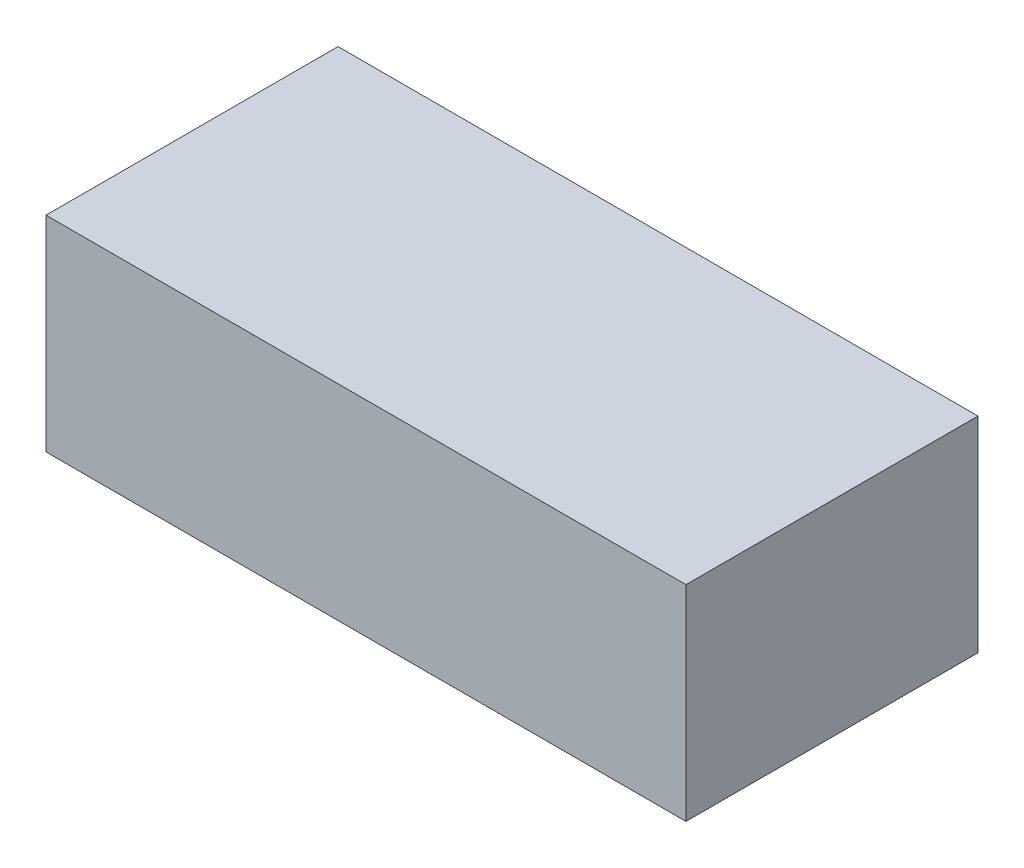
ISO-10303-21;
HEADER;
FILE_DESCRIPTION(('STEP AP214'),'2;1');
FILE_NAME('part.step','',(''),(''),'','','');
FILE_SCHEMA(('AUTOMOTIVE_DESIGN { 1 0 10303 214 1 1 1 1 }'));
ENDSEC;
DATA;
#1=APPLICATION_CONTEXT('core data for automotive mechanical design processes');
#2=APPLICATION_PROTOCOL_DEFINITION('international standard','automotive_design',2000,#1);
#3=PRODUCT_CONTEXT('',#1,'mechanical');
#4=PRODUCT('Part','Part','',(#3));
#5=PRODUCT_RELATED_PRODUCT_CATEGORY('part','',(#4));
#6=PRODUCT_DEFINITION_FORMATION('','',#4);
#7=PRODUCT_DEFINITION_CONTEXT('part definition',#1,'design');
#8=PRODUCT_DEFINITION('design','',#6,#7);
#9=PRODUCT_DEFINITION_SHAPE('','',#8);
#10=(LENGTH_UNIT() NAMED_UNIT(*) SI_UNIT(.MILLI.,.METRE.));
#11=(NAMED_UNIT(*) PLANE_ANGLE_UNIT() SI_UNIT($,.RADIAN.));
#12=(NAMED_UNIT(*) SI_UNIT($,.STERADIAN.) SOLID_ANGLE_UNIT());
#13=UNCERTAINTY_MEASURE_WITH_UNIT(LENGTH_MEASURE(1.E-05),#10,'distance_accuracy_value','');
#14=(GEOMETRIC_REPRESENTATION_CONTEXT(3) GLOBAL_UNCERTAINTY_ASSIGNED_CONTEXT((#13)) GLOBAL_UNIT_ASSIGNED_CONTEXT((#10,
#11,#12)) REPRESENTATION_CONTEXT('',''));
#15=CARTESIAN_POINT('',(0.,0.,0.));
#16=DIRECTION('',(0.,0.,1.));
#17=DIRECTION('',(1.,0.,0.));
#18=AXIS2_PLACEMENT_3D('',#15,#16,#17);
#19=CARTESIAN_POINT('',(51.5,16.5,23.5));
#20=DIRECTION('',(-1.,0.,0.));
#21=DIRECTION('',(0.,0.,1.));
#22=AXIS2_PLACEMENT_3D('',#19,#20,#21);
#23=PLANE('',#22);
#24=DIRECTION('',(0.,1.,0.));
#25=VECTOR('',#24,1.);
#26=CARTESIAN_POINT('',(51.5,16.5,-23.5));
#27=LINE('',#26,#25);
#28=CARTESIAN_POINT('',(51.5,-16.5,-23.5));
#29=VERTEX_POINT('',#28);
#30=CARTESIAN_POINT('',(51.5,16.5,-23.5));
#31=VERTEX_POINT('',#30);
#32=EDGE_CURVE('E102',#29,#31,#27,.T.);
#33=ORIENTED_EDGE('',*,*,#32,.T.);
#34=DIRECTION('',(0.,0.,-1.));
#35=VECTOR('',#34,1.);
#36=CARTESIAN_POINT('',(51.5,16.5,23.5));
#37=LINE('',#36,#35);
#38=CARTESIAN_POINT('',(51.5,16.5,23.5));
#39=VERTEX_POINT('',#38);
#40=EDGE_CURVE('E11',#39,#31,#37,.T.);
#41=ORIENTED_EDGE('',*,*,#40,.F.);
#42=DIRECTION('',(0.,1.,0.));
#43=VECTOR('',#42,1.);
#44=CARTESIAN_POINT('',(51.5,16.5,23.5));
#45=LINE('',#44,#43);
#46=CARTESIAN_POINT('',(51.5,-16.5,23.5));
#47=VERTEX_POINT('',#46);
#48=EDGE_CURVE('E95',#47,#39,#45,.T.);
#49=ORIENTED_EDGE('',*,*,#48,.F.);
#50=DIRECTION('',(0.,0.,-1.));
#51=VECTOR('',#50,1.);
#52=CARTESIAN_POINT('',(51.5,-16.5,23.5));
#53=LINE('',#52,#51);
#54=EDGE_CURVE('E99',#47,#29,#53,.T.);
#55=ORIENTED_EDGE('',*,*,#54,.T.);
#56=EDGE_LOOP('',(#33,#41,#49,#55));
#57=FACE_BOUND('',#56,.T.);
#58=ADVANCED_FACE('F41',(#57),#23,.F.);
#59=CARTESIAN_POINT('',(-51.5,16.5,23.5));
#60=DIRECTION('',(0.,-1.,0.));
#61=DIRECTION('',(0.,0.,-1.));
#62=AXIS2_PLACEMENT_3D('',#59,#60,#61);
#63=PLANE('',#62);
#64=DIRECTION('',(-1.,0.,0.));
#65=VECTOR('',#64,1.);
#66=CARTESIAN_POINT('',(-51.5,16.5,-23.5));
#67=LINE('',#66,#65);
#68=CARTESIAN_POINT('',(-51.5,16.5,-23.5));
#69=VERTEX_POINT('',#68);
#70=EDGE_CURVE('E96',#31,#69,#67,.T.);
#71=ORIENTED_EDGE('',*,*,#70,.T.);
#72=DIRECTION('',(0.,0.,-1.));
#73=VECTOR('',#72,1.);
#74=CARTESIAN_POINT('',(-51.5,16.5,23.5));
#75=LINE('',#74,#73);
#76=CARTESIAN_POINT('',(-51.5,16.5,23.5));
#77=VERTEX_POINT('',#76);
#78=EDGE_CURVE('E47',#77,#69,#75,.T.);
#79=ORIENTED_EDGE('',*,*,#78,.F.);
#80=DIRECTION('',(-1.,0.,0.));
#81=VECTOR('',#80,1.);
#82=CARTESIAN_POINT('',(-51.5,16.5,23.5));
#83=LINE('',#82,#81);
#84=EDGE_CURVE('E87',#39,#77,#83,.T.);
#85=ORIENTED_EDGE('',*,*,#84,.F.);
#86=ORIENTED_EDGE('',*,*,#40,.T.);
#87=EDGE_LOOP('',(#71,#79,#85,#86));
#88=FACE_BOUND('',#87,.T.);
#89=ADVANCED_FACE('F92',(#88),#63,.F.);
#90=CARTESIAN_POINT('',(-51.5,16.5,23.5));
#91=DIRECTION('',(1.,0.,0.));
#92=DIRECTION('',(0.,0.,-1.));
#93=AXIS2_PLACEMENT_3D('',#90,#91,#92);
#94=PLANE('',#93);
#95=DIRECTION('',(0.,-1.,0.));
#96=VECTOR('',#95,1.);
#97=CARTESIAN_POINT('',(-51.5,16.5,-23.5));
#98=LINE('',#97,#96);
#99=CARTESIAN_POINT('',(-51.5,-16.5,-23.5));
#100=VERTEX_POINT('',#99);
#101=EDGE_CURVE('E74',#69,#100,#98,.T.);
#102=ORIENTED_EDGE('',*,*,#101,.T.);
#103=DIRECTION('',(0.,0.,-1.));
#104=VECTOR('',#103,1.);
#105=CARTESIAN_POINT('',(-51.5,-16.5,23.5));
#106=LINE('',#105,#104);
#107=CARTESIAN_POINT('',(-51.5,-16.5,23.5));
#108=VERTEX_POINT('',#107);
#109=EDGE_CURVE('E100',#108,#100,#106,.T.);
#110=ORIENTED_EDGE('',*,*,#109,.F.);
#111=DIRECTION('',(0.,-1.,0.));
#112=VECTOR('',#111,1.);
#113=CARTESIAN_POINT('',(-51.5,16.5,23.5));
#114=LINE('',#113,#112);
#115=EDGE_CURVE('E89',#77,#108,#114,.T.);
#116=ORIENTED_EDGE('',*,*,#115,.F.);
#117=ORIENTED_EDGE('',*,*,#78,.T.);
#118=EDGE_LOOP('',(#102,#110,#116,#117));
#119=FACE_BOUND('',#118,.T.);
#120=ADVANCED_FACE('F98',(#119),#94,.F.);
#121=CARTESIAN_POINT('',(-51.5,-16.5,23.5));
#122=DIRECTION('',(0.,1.,0.));
#123=DIRECTION('',(0.,0.,1.));
#124=AXIS2_PLACEMENT_3D('',#121,#122,#123);
#125=PLANE('',#124);
#126=DIRECTION('',(1.,0.,0.));
#127=VECTOR('',#126,1.);
#128=CARTESIAN_POINT('',(-51.5,-16.5,-23.5));
#129=LINE('',#128,#127);
#130=EDGE_CURVE('E78',#100,#29,#129,.T.);
#131=ORIENTED_EDGE('',*,*,#130,.T.);
#132=ORIENTED_EDGE('',*,*,#54,.F.);
#133=DIRECTION('',(1.,0.,0.));
#134=VECTOR('',#133,1.);
#135=CARTESIAN_POINT('',(-51.5,-16.5,23.5));
#136=LINE('',#135,#134);
#137=EDGE_CURVE('E60',#108,#47,#136,.T.);
#138=ORIENTED_EDGE('',*,*,#137,.F.);
#139=ORIENTED_EDGE('',*,*,#109,.T.);
#140=EDGE_LOOP('',(#131,#132,#138,#139));
#141=FACE_BOUND('',#140,.T.);
#142=ADVANCED_FACE('F112',(#141),#125,.F.);
#143=CARTESIAN_POINT('',(0.,0.,23.5));
#144=DIRECTION('',(0.,0.,1.));
#145=DIRECTION('',(1.,0.,0.));
#146=AXIS2_PLACEMENT_3D('',#143,#144,#145);
#147=PLANE('',#146);
#148=ORIENTED_EDGE('',*,*,#48,.T.);
#149=ORIENTED_EDGE('',*,*,#84,.T.);
#150=ORIENTED_EDGE('',*,*,#115,.T.);
#151=ORIENTED_EDGE('',*,*,#137,.T.);
#152=EDGE_LOOP('',(#148,#149,#150,#151));
#153=FACE_BOUND('',#152,.T.);
#154=ADVANCED_FACE('F86',(#153),#147,.T.);
#155=CARTESIAN_POINT('',(0.,0.,-23.5));
#156=DIRECTION('',(0.,0.,1.));
#157=DIRECTION('',(1.,0.,0.));
#158=AXIS2_PLACEMENT_3D('',#155,#156,#157);
#159=PLANE('',#158);
#160=ORIENTED_EDGE('',*,*,#32,.F.);
#161=ORIENTED_EDGE('',*,*,#130,.F.);
#162=ORIENTED_EDGE('',*,*,#101,.F.);
#163=ORIENTED_EDGE('',*,*,#70,.F.);
#164=EDGE_LOOP('',(#160,#161,#162,#163));
#165=FACE_BOUND('',#164,.T.);
#166=ADVANCED_FACE('F111',(#165),#159,.F.);
#167=CLOSED_SHELL('',(#58,#89,#120,#142,#154,#166));
#168=MANIFOLD_SOLID_BREP('B2',#167);
#169=ADVANCED_BREP_SHAPE_REPRESENTATION('',(#18,#168),#14);
#170=SHAPE_DEFINITION_REPRESENTATION(#9,#169);
ENDSEC;
END-ISO-10303-21;
